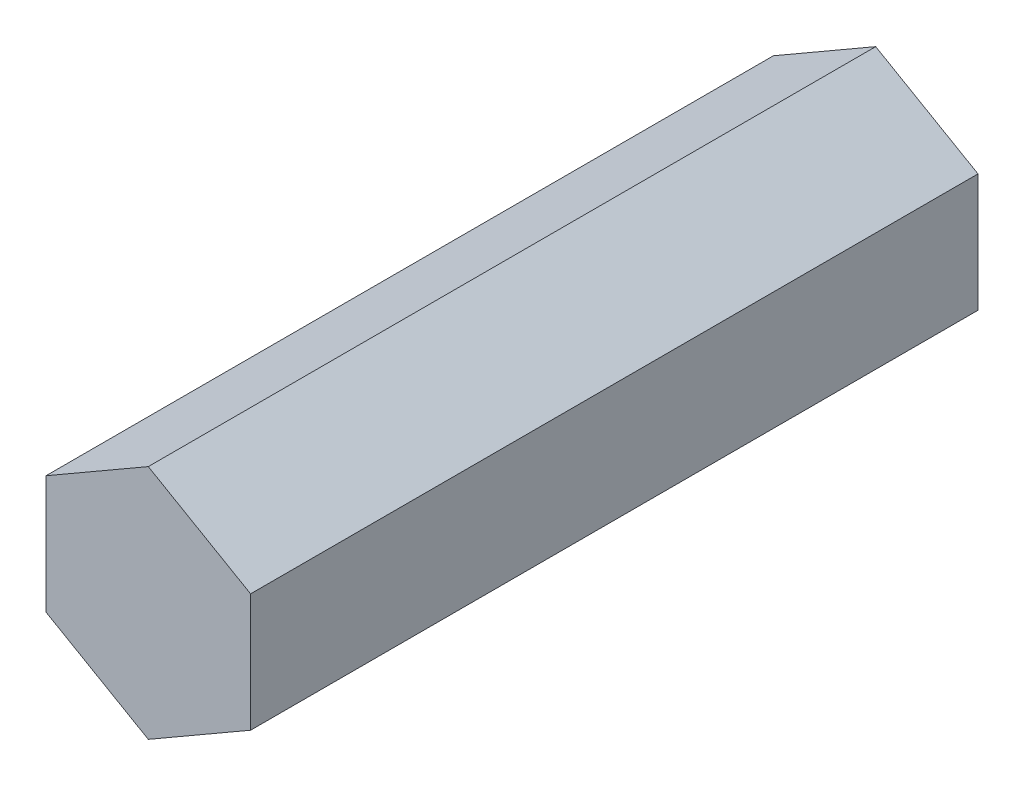
ISO-10303-21;
HEADER;
FILE_DESCRIPTION(('STEP AP214'),'2;1');
FILE_NAME('part.step','',(''),(''),'','','');
FILE_SCHEMA(('AUTOMOTIVE_DESIGN { 1 0 10303 214 1 1 1 1 }'));
ENDSEC;
DATA;
#1=APPLICATION_CONTEXT('core data for automotive mechanical design processes');
#2=APPLICATION_PROTOCOL_DEFINITION('international standard','automotive_design',2000,#1);
#3=PRODUCT_CONTEXT('',#1,'mechanical');
#4=PRODUCT('Part','Part','',(#3));
#5=PRODUCT_RELATED_PRODUCT_CATEGORY('part','',(#4));
#6=PRODUCT_DEFINITION_FORMATION('','',#4);
#7=PRODUCT_DEFINITION_CONTEXT('part definition',#1,'design');
#8=PRODUCT_DEFINITION('design','',#6,#7);
#9=PRODUCT_DEFINITION_SHAPE('','',#8);
#10=(LENGTH_UNIT() NAMED_UNIT(*) SI_UNIT(.MILLI.,.METRE.));
#11=(NAMED_UNIT(*) PLANE_ANGLE_UNIT() SI_UNIT($,.RADIAN.));
#12=(NAMED_UNIT(*) SI_UNIT($,.STERADIAN.) SOLID_ANGLE_UNIT());
#13=UNCERTAINTY_MEASURE_WITH_UNIT(LENGTH_MEASURE(1.E-05),#10,'distance_accuracy_value','');
#14=(GEOMETRIC_REPRESENTATION_CONTEXT(3) GLOBAL_UNCERTAINTY_ASSIGNED_CONTEXT((#13)) GLOBAL_UNIT_ASSIGNED_CONTEXT((#10,
#11,#12)) REPRESENTATION_CONTEXT('',''));
#15=CARTESIAN_POINT('',(0.,0.,0.));
#16=DIRECTION('',(0.,0.,1.));
#17=DIRECTION('',(1.,0.,0.));
#18=AXIS2_PLACEMENT_3D('',#15,#16,#17);
#19=CARTESIAN_POINT('',(-7.14375,4.1244459855234,25.4));
#20=DIRECTION('',(0.5,-0.866025403784439,0.));
#21=DIRECTION('',(0.866025403784439,0.5,0.));
#22=AXIS2_PLACEMENT_3D('',#19,#20,#21);
#23=PLANE('',#22);
#24=DIRECTION('',(-0.866025403784439,-0.5,0.));
#25=VECTOR('',#24,1.);
#26=CARTESIAN_POINT('',(-7.14375,4.1244459855234,-25.4));
#27=LINE('',#26,#25);
#28=CARTESIAN_POINT('',(0.,8.24889197104678,-25.4));
#29=VERTEX_POINT('',#28);
#30=CARTESIAN_POINT('',(-7.14375,4.1244459855234,-25.4));
#31=VERTEX_POINT('',#30);
#32=EDGE_CURVE('E128',#29,#31,#27,.T.);
#33=ORIENTED_EDGE('',*,*,#32,.T.);
#34=DIRECTION('',(0.,0.,-1.));
#35=VECTOR('',#34,1.);
#36=CARTESIAN_POINT('',(-7.14375,4.1244459855234,25.4));
#37=LINE('',#36,#35);
#38=CARTESIAN_POINT('',(-7.14375,4.1244459855234,25.4));
#39=VERTEX_POINT('',#38);
#40=EDGE_CURVE('E11',#39,#31,#37,.T.);
#41=ORIENTED_EDGE('',*,*,#40,.F.);
#42=DIRECTION('',(-0.866025403784439,-0.5,0.));
#43=VECTOR('',#42,1.);
#44=CARTESIAN_POINT('',(-7.14375,4.1244459855234,25.4));
#45=LINE('',#44,#43);
#46=CARTESIAN_POINT('',(0.,8.24889197104678,25.4));
#47=VERTEX_POINT('',#46);
#48=EDGE_CURVE('E144',#47,#39,#45,.T.);
#49=ORIENTED_EDGE('',*,*,#48,.F.);
#50=DIRECTION('',(0.,0.,-1.));
#51=VECTOR('',#50,1.);
#52=CARTESIAN_POINT('',(0.,8.24889197104678,25.4));
#53=LINE('',#52,#51);
#54=EDGE_CURVE('E124',#47,#29,#53,.T.);
#55=ORIENTED_EDGE('',*,*,#54,.T.);
#56=EDGE_LOOP('',(#33,#41,#49,#55));
#57=FACE_BOUND('',#56,.T.);
#58=ADVANCED_FACE('F39',(#57),#23,.F.);
#59=CARTESIAN_POINT('',(-7.14375,-4.12444598552339,25.4));
#60=DIRECTION('',(1.,0.,0.));
#61=DIRECTION('',(0.,1.,0.));
#62=AXIS2_PLACEMENT_3D('',#59,#60,#61);
#63=PLANE('',#62);
#64=DIRECTION('',(0.,-1.,0.));
#65=VECTOR('',#64,1.);
#66=CARTESIAN_POINT('',(-7.14375,-4.12444598552339,-25.4));
#67=LINE('',#66,#65);
#68=CARTESIAN_POINT('',(-7.14375,-4.12444598552339,-25.4));
#69=VERTEX_POINT('',#68);
#70=EDGE_CURVE('E132',#31,#69,#67,.T.);
#71=ORIENTED_EDGE('',*,*,#70,.T.);
#72=DIRECTION('',(0.,0.,-1.));
#73=VECTOR('',#72,1.);
#74=CARTESIAN_POINT('',(-7.14375,-4.12444598552339,25.4));
#75=LINE('',#74,#73);
#76=CARTESIAN_POINT('',(-7.14375,-4.12444598552339,25.4));
#77=VERTEX_POINT('',#76);
#78=EDGE_CURVE('E48',#77,#69,#75,.T.);
#79=ORIENTED_EDGE('',*,*,#78,.F.);
#80=DIRECTION('',(0.,-1.,0.));
#81=VECTOR('',#80,1.);
#82=CARTESIAN_POINT('',(-7.14375,-4.12444598552339,25.4));
#83=LINE('',#82,#81);
#84=EDGE_CURVE('E93',#39,#77,#83,.T.);
#85=ORIENTED_EDGE('',*,*,#84,.F.);
#86=ORIENTED_EDGE('',*,*,#40,.T.);
#87=EDGE_LOOP('',(#71,#79,#85,#86));
#88=FACE_BOUND('',#87,.T.);
#89=ADVANCED_FACE('F172',(#88),#63,.F.);
#90=CARTESIAN_POINT('',(0.,-8.24889197104678,25.4));
#91=DIRECTION('',(0.5,0.866025403784439,0.));
#92=DIRECTION('',(-0.866025403784439,0.5,0.));
#93=AXIS2_PLACEMENT_3D('',#90,#91,#92);
#94=PLANE('',#93);
#95=DIRECTION('',(0.866025403784439,-0.5,0.));
#96=VECTOR('',#95,1.);
#97=CARTESIAN_POINT('',(0.,-8.24889197104678,-25.4));
#98=LINE('',#97,#96);
#99=CARTESIAN_POINT('',(0.,-8.24889197104678,-25.4));
#100=VERTEX_POINT('',#99);
#101=EDGE_CURVE('E135',#69,#100,#98,.T.);
#102=ORIENTED_EDGE('',*,*,#101,.T.);
#103=DIRECTION('',(0.,0.,-1.));
#104=VECTOR('',#103,1.);
#105=CARTESIAN_POINT('',(0.,-8.24889197104678,25.4));
#106=LINE('',#105,#104);
#107=CARTESIAN_POINT('',(0.,-8.24889197104678,25.4));
#108=VERTEX_POINT('',#107);
#109=EDGE_CURVE('E117',#108,#100,#106,.T.);
#110=ORIENTED_EDGE('',*,*,#109,.F.);
#111=DIRECTION('',(0.866025403784439,-0.5,0.));
#112=VECTOR('',#111,1.);
#113=CARTESIAN_POINT('',(0.,-8.24889197104678,25.4));
#114=LINE('',#113,#112);
#115=EDGE_CURVE('E106',#77,#108,#114,.T.);
#116=ORIENTED_EDGE('',*,*,#115,.F.);
#117=ORIENTED_EDGE('',*,*,#78,.T.);
#118=EDGE_LOOP('',(#102,#110,#116,#117));
#119=FACE_BOUND('',#118,.T.);
#120=ADVANCED_FACE('F154',(#119),#94,.F.);
#121=CARTESIAN_POINT('',(7.14375,-4.1244459855234,25.4));
#122=DIRECTION('',(-0.5,0.866025403784439,0.));
#123=DIRECTION('',(-0.866025403784439,-0.5,0.));
#124=AXIS2_PLACEMENT_3D('',#121,#122,#123);
#125=PLANE('',#124);
#126=DIRECTION('',(0.866025403784439,0.5,0.));
#127=VECTOR('',#126,1.);
#128=CARTESIAN_POINT('',(7.14375,-4.1244459855234,-25.4));
#129=LINE('',#128,#127);
#130=CARTESIAN_POINT('',(7.14375,-4.1244459855234,-25.4));
#131=VERTEX_POINT('',#130);
#132=EDGE_CURVE('E115',#100,#131,#129,.T.);
#133=ORIENTED_EDGE('',*,*,#132,.T.);
#134=DIRECTION('',(0.,0.,-1.));
#135=VECTOR('',#134,1.);
#136=CARTESIAN_POINT('',(7.14375,-4.1244459855234,25.4));
#137=LINE('',#136,#135);
#138=CARTESIAN_POINT('',(7.14375,-4.1244459855234,25.4));
#139=VERTEX_POINT('',#138);
#140=EDGE_CURVE('E112',#139,#131,#137,.T.);
#141=ORIENTED_EDGE('',*,*,#140,.F.);
#142=DIRECTION('',(0.866025403784439,0.5,0.));
#143=VECTOR('',#142,1.);
#144=CARTESIAN_POINT('',(7.14375,-4.1244459855234,25.4));
#145=LINE('',#144,#143);
#146=EDGE_CURVE('E100',#108,#139,#145,.T.);
#147=ORIENTED_EDGE('',*,*,#146,.F.);
#148=ORIENTED_EDGE('',*,*,#109,.T.);
#149=EDGE_LOOP('',(#133,#141,#147,#148));
#150=FACE_BOUND('',#149,.T.);
#151=ADVANCED_FACE('F113',(#150),#125,.F.);
#152=CARTESIAN_POINT('',(7.14375,4.12444598552339,25.4));
#153=DIRECTION('',(-1.,0.,0.));
#154=DIRECTION('',(0.,-1.,0.));
#155=AXIS2_PLACEMENT_3D('',#152,#153,#154);
#156=PLANE('',#155);
#157=DIRECTION('',(0.,1.,0.));
#158=VECTOR('',#157,1.);
#159=CARTESIAN_POINT('',(7.14375,4.12444598552339,-25.4));
#160=LINE('',#159,#158);
#161=CARTESIAN_POINT('',(7.14375,4.12444598552339,-25.4));
#162=VERTEX_POINT('',#161);
#163=EDGE_CURVE('E79',#131,#162,#160,.T.);
#164=ORIENTED_EDGE('',*,*,#163,.T.);
#165=DIRECTION('',(0.,0.,-1.));
#166=VECTOR('',#165,1.);
#167=CARTESIAN_POINT('',(7.14375,4.12444598552339,25.4));
#168=LINE('',#167,#166);
#169=CARTESIAN_POINT('',(7.14375,4.12444598552339,25.4));
#170=VERTEX_POINT('',#169);
#171=EDGE_CURVE('E118',#170,#162,#168,.T.);
#172=ORIENTED_EDGE('',*,*,#171,.F.);
#173=DIRECTION('',(0.,1.,0.));
#174=VECTOR('',#173,1.);
#175=CARTESIAN_POINT('',(7.14375,4.12444598552339,25.4));
#176=LINE('',#175,#174);
#177=EDGE_CURVE('E104',#139,#170,#176,.T.);
#178=ORIENTED_EDGE('',*,*,#177,.F.);
#179=ORIENTED_EDGE('',*,*,#140,.T.);
#180=EDGE_LOOP('',(#164,#172,#178,#179));
#181=FACE_BOUND('',#180,.T.);
#182=ADVANCED_FACE('F120',(#181),#156,.F.);
#183=CARTESIAN_POINT('',(0.,8.24889197104678,25.4));
#184=DIRECTION('',(-0.5,-0.866025403784439,0.));
#185=DIRECTION('',(0.866025403784439,-0.5,0.));
#186=AXIS2_PLACEMENT_3D('',#183,#184,#185);
#187=PLANE('',#186);
#188=DIRECTION('',(-0.866025403784439,0.5,0.));
#189=VECTOR('',#188,1.);
#190=CARTESIAN_POINT('',(0.,8.24889197104678,-25.4));
#191=LINE('',#190,#189);
#192=EDGE_CURVE('E85',#162,#29,#191,.T.);
#193=ORIENTED_EDGE('',*,*,#192,.T.);
#194=ORIENTED_EDGE('',*,*,#54,.F.);
#195=DIRECTION('',(-0.866025403784439,0.5,0.));
#196=VECTOR('',#195,1.);
#197=CARTESIAN_POINT('',(0.,8.24889197104678,25.4));
#198=LINE('',#197,#196);
#199=EDGE_CURVE('E56',#170,#47,#198,.T.);
#200=ORIENTED_EDGE('',*,*,#199,.F.);
#201=ORIENTED_EDGE('',*,*,#171,.T.);
#202=EDGE_LOOP('',(#193,#194,#200,#201));
#203=FACE_BOUND('',#202,.T.);
#204=ADVANCED_FACE('F161',(#203),#187,.F.);
#205=CARTESIAN_POINT('',(0.,0.,25.4));
#206=DIRECTION('',(0.,0.,-1.));
#207=DIRECTION('',(-1.,0.,0.));
#208=AXIS2_PLACEMENT_3D('',#205,#206,#207);
#209=PLANE('',#208);
#210=ORIENTED_EDGE('',*,*,#48,.T.);
#211=ORIENTED_EDGE('',*,*,#84,.T.);
#212=ORIENTED_EDGE('',*,*,#115,.T.);
#213=ORIENTED_EDGE('',*,*,#146,.T.);
#214=ORIENTED_EDGE('',*,*,#177,.T.);
#215=ORIENTED_EDGE('',*,*,#199,.T.);
#216=EDGE_LOOP('',(#210,#211,#212,#213,#214,#215));
#217=FACE_BOUND('',#216,.T.);
#218=ADVANCED_FACE('F102',(#217),#209,.F.);
#219=CARTESIAN_POINT('',(0.,0.,-25.4));
#220=DIRECTION('',(0.,0.,-1.));
#221=DIRECTION('',(-1.,0.,0.));
#222=AXIS2_PLACEMENT_3D('',#219,#220,#221);
#223=PLANE('',#222);
#224=ORIENTED_EDGE('',*,*,#32,.F.);
#225=ORIENTED_EDGE('',*,*,#192,.F.);
#226=ORIENTED_EDGE('',*,*,#163,.F.);
#227=ORIENTED_EDGE('',*,*,#132,.F.);
#228=ORIENTED_EDGE('',*,*,#101,.F.);
#229=ORIENTED_EDGE('',*,*,#70,.F.);
#230=EDGE_LOOP('',(#224,#225,#226,#227,#228,#229));
#231=FACE_BOUND('',#230,.T.);
#232=ADVANCED_FACE('F157',(#231),#223,.T.);
#233=CLOSED_SHELL('',(#58,#89,#120,#151,#182,#204,#218,#232));
#234=MANIFOLD_SOLID_BREP('B2',#233);
#235=ADVANCED_BREP_SHAPE_REPRESENTATION('',(#18,#234),#14);
#236=SHAPE_DEFINITION_REPRESENTATION(#9,#235);
ENDSEC;
END-ISO-10303-21;
